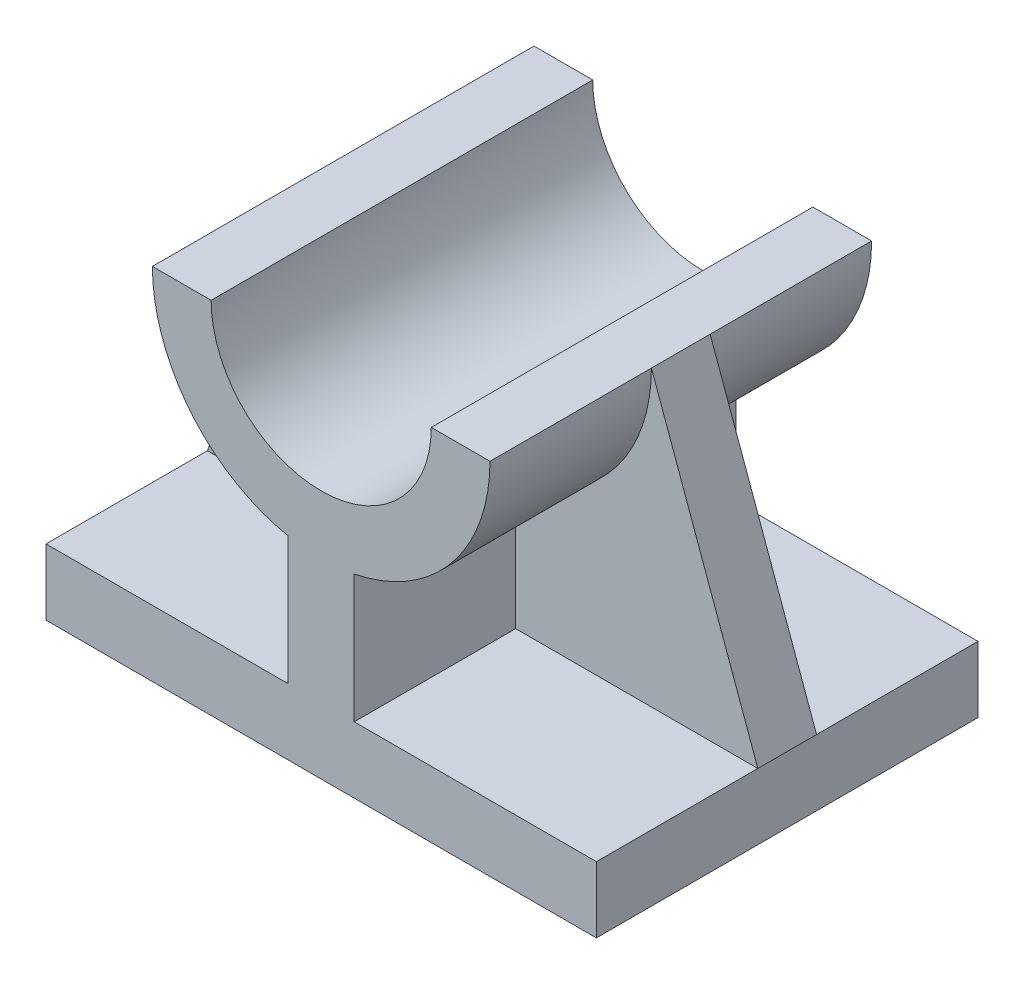
ISO-10303-21;
HEADER;
FILE_DESCRIPTION(('STEP AP214'),'2;1');
FILE_NAME('part.step','',(''),(''),'','','');
FILE_SCHEMA(('AUTOMOTIVE_DESIGN { 1 0 10303 214 1 1 1 1 }'));
ENDSEC;
DATA;
#1=APPLICATION_CONTEXT('core data for automotive mechanical design processes');
#2=APPLICATION_PROTOCOL_DEFINITION('international standard','automotive_design',2000,#1);
#3=PRODUCT_CONTEXT('',#1,'mechanical');
#4=PRODUCT('Part','Part','',(#3));
#5=PRODUCT_RELATED_PRODUCT_CATEGORY('part','',(#4));
#6=PRODUCT_DEFINITION_FORMATION('','',#4);
#7=PRODUCT_DEFINITION_CONTEXT('part definition',#1,'design');
#8=PRODUCT_DEFINITION('design','',#6,#7);
#9=PRODUCT_DEFINITION_SHAPE('','',#8);
#10=(LENGTH_UNIT() NAMED_UNIT(*) SI_UNIT(.MILLI.,.METRE.));
#11=(NAMED_UNIT(*) PLANE_ANGLE_UNIT() SI_UNIT($,.RADIAN.));
#12=(NAMED_UNIT(*) SI_UNIT($,.STERADIAN.) SOLID_ANGLE_UNIT());
#13=UNCERTAINTY_MEASURE_WITH_UNIT(LENGTH_MEASURE(1.E-05),#10,'distance_accuracy_value','');
#14=(GEOMETRIC_REPRESENTATION_CONTEXT(3) GLOBAL_UNCERTAINTY_ASSIGNED_CONTEXT((#13)) GLOBAL_UNIT_ASSIGNED_CONTEXT((#10,
#11,#12)) REPRESENTATION_CONTEXT('',''));
#15=CARTESIAN_POINT('',(0.,0.,0.));
#16=DIRECTION('',(0.,0.,1.));
#17=DIRECTION('',(1.,0.,0.));
#18=AXIS2_PLACEMENT_3D('',#15,#16,#17);
#19=CARTESIAN_POINT('',(10.4217391304348,49.,52.));
#20=DIRECTION('',(0.,0.,-1.));
#21=DIRECTION('',(-1.,0.,0.));
#22=AXIS2_PLACEMENT_3D('',#19,#20,#21);
#23=CYLINDRICAL_SURFACE('',#22,23.);
#24=CARTESIAN_POINT('',(10.4217391304348,49.,22.));
#25=DIRECTION('',(0.,0.,1.));
#26=DIRECTION('',(1.,0.,0.));
#27=AXIS2_PLACEMENT_3D('',#24,#25,#26);
#28=CIRCLE('',#27,23.);
#29=CARTESIAN_POINT('',(-12.5782608695652,49.,22.));
#30=VERTEX_POINT('',#29);
#31=CARTESIAN_POINT('',(5.92173913043479,26.4445128627201,22.));
#32=VERTEX_POINT('',#31);
#33=EDGE_CURVE('E200',#30,#32,#28,.T.);
#34=ORIENTED_EDGE('',*,*,#33,.F.);
#35=DIRECTION('',(0.,0.,-1.));
#36=VECTOR('',#35,1.);
#37=CARTESIAN_POINT('',(-12.5782608695652,49.,52.));
#38=LINE('',#37,#36);
#39=CARTESIAN_POINT('',(-12.5782608695652,49.,0.));
#40=VERTEX_POINT('',#39);
#41=EDGE_CURVE('E360',#30,#40,#38,.T.);
#42=ORIENTED_EDGE('',*,*,#41,.T.);
#43=CARTESIAN_POINT('',(10.4217391304348,49.,0.));
#44=DIRECTION('',(0.,0.,1.));
#45=DIRECTION('',(1.,0.,0.));
#46=AXIS2_PLACEMENT_3D('',#43,#44,#45);
#47=CIRCLE('',#46,23.);
#48=CARTESIAN_POINT('',(5.92173913043479,26.4445128627201,0.));
#49=VERTEX_POINT('',#48);
#50=EDGE_CURVE('E267',#40,#49,#47,.T.);
#51=ORIENTED_EDGE('',*,*,#50,.T.);
#52=DIRECTION('',(0.,0.,-1.));
#53=VECTOR('',#52,1.);
#54=CARTESIAN_POINT('',(5.92173913043479,26.4445128627201,52.));
#55=LINE('',#54,#53);
#56=EDGE_CURVE('E340',#32,#49,#55,.T.);
#57=ORIENTED_EDGE('',*,*,#56,.F.);
#58=EDGE_LOOP('',(#34,#42,#51,#57));
#59=FACE_BOUND('',#58,.T.);
#60=ADVANCED_FACE('F39',(#59),#23,.T.);
#61=CARTESIAN_POINT('',(5.9217391304348,0.,52.));
#62=DIRECTION('',(-1.,0.,0.));
#63=DIRECTION('',(0.,-1.,0.));
#64=AXIS2_PLACEMENT_3D('',#61,#62,#63);
#65=PLANE('',#64);
#66=DIRECTION('',(0.,0.,-1.));
#67=VECTOR('',#66,1.);
#68=CARTESIAN_POINT('',(5.9217391304348,9.,52.));
#69=LINE('',#68,#67);
#70=CARTESIAN_POINT('',(5.9217391304348,9.,22.));
#71=VERTEX_POINT('',#70);
#72=CARTESIAN_POINT('',(5.9217391304348,9.,0.));
#73=VERTEX_POINT('',#72);
#74=EDGE_CURVE('E206',#71,#73,#69,.T.);
#75=ORIENTED_EDGE('',*,*,#74,.F.);
#76=DIRECTION('',(0.,1.,0.));
#77=VECTOR('',#76,1.);
#78=CARTESIAN_POINT('',(5.9217391304348,0.,22.));
#79=LINE('',#78,#77);
#80=EDGE_CURVE('E327',#71,#32,#79,.T.);
#81=ORIENTED_EDGE('',*,*,#80,.T.);
#82=ORIENTED_EDGE('',*,*,#56,.T.);
#83=DIRECTION('',(0.,1.,0.));
#84=VECTOR('',#83,1.);
#85=CARTESIAN_POINT('',(5.9217391304348,0.,0.));
#86=LINE('',#85,#84);
#87=EDGE_CURVE('E264',#73,#49,#86,.T.);
#88=ORIENTED_EDGE('',*,*,#87,.F.);
#89=EDGE_LOOP('',(#75,#81,#82,#88));
#90=FACE_BOUND('',#89,.T.);
#91=ADVANCED_FACE('F338',(#90),#65,.T.);
#92=CARTESIAN_POINT('',(0.,9.,52.));
#93=DIRECTION('',(0.,1.,0.));
#94=DIRECTION('',(0.,0.,1.));
#95=AXIS2_PLACEMENT_3D('',#92,#93,#94);
#96=PLANE('',#95);
#97=DIRECTION('',(0.,0.,-1.));
#98=VECTOR('',#97,1.);
#99=CARTESIAN_POINT('',(-27.0782608695652,9.,52.));
#100=LINE('',#99,#98);
#101=CARTESIAN_POINT('',(-27.0782608695652,9.,22.));
#102=VERTEX_POINT('',#101);
#103=CARTESIAN_POINT('',(-27.0782608695652,9.,0.));
#104=VERTEX_POINT('',#103);
#105=EDGE_CURVE('E182',#102,#104,#100,.T.);
#106=ORIENTED_EDGE('',*,*,#105,.F.);
#107=DIRECTION('',(1.,0.,0.));
#108=VECTOR('',#107,1.);
#109=CARTESIAN_POINT('',(0.,9.,22.));
#110=LINE('',#109,#108);
#111=EDGE_CURVE('E191',#102,#71,#110,.T.);
#112=ORIENTED_EDGE('',*,*,#111,.T.);
#113=ORIENTED_EDGE('',*,*,#74,.T.);
#114=DIRECTION('',(1.,0.,0.));
#115=VECTOR('',#114,1.);
#116=CARTESIAN_POINT('',(0.,9.,0.));
#117=LINE('',#116,#115);
#118=EDGE_CURVE('E261',#104,#73,#117,.T.);
#119=ORIENTED_EDGE('',*,*,#118,.F.);
#120=EDGE_LOOP('',(#106,#112,#113,#119));
#121=FACE_BOUND('',#120,.T.);
#122=ADVANCED_FACE('F334',(#121),#96,.T.);
#123=CARTESIAN_POINT('',(0.,9.,52.));
#124=DIRECTION('',(0.,-1.,0.));
#125=DIRECTION('',(0.,0.,-1.));
#126=AXIS2_PLACEMENT_3D('',#123,#124,#125);
#127=PLANE('',#126);
#128=DIRECTION('',(1.,0.,0.));
#129=VECTOR('',#128,1.);
#130=CARTESIAN_POINT('',(0.,9.,30.));
#131=LINE('',#130,#129);
#132=CARTESIAN_POINT('',(14.9217391304348,9.,30.));
#133=VERTEX_POINT('',#132);
#134=CARTESIAN_POINT('',(47.9217391304348,9.00000000000001,30.));
#135=VERTEX_POINT('',#134);
#136=EDGE_CURVE('E312',#133,#135,#131,.T.);
#137=ORIENTED_EDGE('',*,*,#136,.F.);
#138=DIRECTION('',(0.,0.,-1.));
#139=VECTOR('',#138,1.);
#140=CARTESIAN_POINT('',(14.9217391304348,9.,52.));
#141=LINE('',#140,#139);
#142=CARTESIAN_POINT('',(14.9217391304348,9.,52.));
#143=VERTEX_POINT('',#142);
#144=EDGE_CURVE('E224',#143,#133,#141,.T.);
#145=ORIENTED_EDGE('',*,*,#144,.F.);
#146=DIRECTION('',(-1.,0.,0.));
#147=VECTOR('',#146,1.);
#148=CARTESIAN_POINT('',(0.,9.,52.));
#149=LINE('',#148,#147);
#150=CARTESIAN_POINT('',(47.9217391304348,9.,52.));
#151=VERTEX_POINT('',#150);
#152=EDGE_CURVE('E283',#151,#143,#149,.T.);
#153=ORIENTED_EDGE('',*,*,#152,.F.);
#154=DIRECTION('',(0.,0.,-1.));
#155=VECTOR('',#154,1.);
#156=CARTESIAN_POINT('',(47.9217391304348,9.,52.));
#157=LINE('',#156,#155);
#158=EDGE_CURVE('E218',#151,#135,#157,.T.);
#159=ORIENTED_EDGE('',*,*,#158,.T.);
#160=EDGE_LOOP('',(#137,#145,#153,#159));
#161=FACE_BOUND('',#160,.T.);
#162=ADVANCED_FACE('F398',(#161),#127,.F.);
#163=CARTESIAN_POINT('',(14.9217391304348,0.,52.));
#164=DIRECTION('',(-1.,0.,0.));
#165=DIRECTION('',(0.,0.,1.));
#166=AXIS2_PLACEMENT_3D('',#163,#164,#165);
#167=PLANE('',#166);
#168=DIRECTION('',(0.,-1.,0.));
#169=VECTOR('',#168,1.);
#170=CARTESIAN_POINT('',(14.9217391304348,0.,30.));
#171=LINE('',#170,#169);
#172=CARTESIAN_POINT('',(14.9217391304348,26.4445128627201,30.));
#173=VERTEX_POINT('',#172);
#174=EDGE_CURVE('E315',#173,#133,#171,.T.);
#175=ORIENTED_EDGE('',*,*,#174,.F.);
#176=DIRECTION('',(0.,0.,-1.));
#177=VECTOR('',#176,1.);
#178=CARTESIAN_POINT('',(14.9217391304348,26.4445128627201,52.));
#179=LINE('',#178,#177);
#180=CARTESIAN_POINT('',(14.9217391304348,26.4445128627201,52.));
#181=VERTEX_POINT('',#180);
#182=EDGE_CURVE('E228',#181,#173,#179,.T.);
#183=ORIENTED_EDGE('',*,*,#182,.F.);
#184=DIRECTION('',(0.,1.,0.));
#185=VECTOR('',#184,1.);
#186=CARTESIAN_POINT('',(14.9217391304348,0.,52.));
#187=LINE('',#186,#185);
#188=EDGE_CURVE('E281',#143,#181,#187,.T.);
#189=ORIENTED_EDGE('',*,*,#188,.F.);
#190=ORIENTED_EDGE('',*,*,#144,.T.);
#191=EDGE_LOOP('',(#175,#183,#189,#190));
#192=FACE_BOUND('',#191,.T.);
#193=ADVANCED_FACE('F401',(#192),#167,.F.);
#194=CARTESIAN_POINT('',(10.4217391304348,49.,52.));
#195=DIRECTION('',(0.,0.,-1.));
#196=DIRECTION('',(-1.,0.,0.));
#197=AXIS2_PLACEMENT_3D('',#194,#195,#196);
#198=CYLINDRICAL_SURFACE('',#197,23.);
#199=CARTESIAN_POINT('',(10.4217391304348,49.,30.));
#200=DIRECTION('',(0.,0.,-1.));
#201=DIRECTION('',(-1.,0.,0.));
#202=AXIS2_PLACEMENT_3D('',#199,#200,#201);
#203=CIRCLE('',#202,23.);
#204=CARTESIAN_POINT('',(33.4217391304348,49.,30.));
#205=VERTEX_POINT('',#204);
#206=EDGE_CURVE('E317',#205,#173,#203,.T.);
#207=ORIENTED_EDGE('',*,*,#206,.F.);
#208=DIRECTION('',(0.,0.,-1.));
#209=VECTOR('',#208,1.);
#210=CARTESIAN_POINT('',(33.4217391304348,49.,52.));
#211=LINE('',#210,#209);
#212=CARTESIAN_POINT('',(33.4217391304348,49.,52.));
#213=VERTEX_POINT('',#212);
#214=EDGE_CURVE('E232',#213,#205,#211,.T.);
#215=ORIENTED_EDGE('',*,*,#214,.F.);
#216=CARTESIAN_POINT('',(10.4217391304348,49.,52.));
#217=DIRECTION('',(0.,0.,1.));
#218=DIRECTION('',(1.,0.,0.));
#219=AXIS2_PLACEMENT_3D('',#216,#217,#218);
#220=CIRCLE('',#219,23.);
#221=EDGE_CURVE('E279',#181,#213,#220,.T.);
#222=ORIENTED_EDGE('',*,*,#221,.F.);
#223=ORIENTED_EDGE('',*,*,#182,.T.);
#224=EDGE_LOOP('',(#207,#215,#222,#223));
#225=FACE_BOUND('',#224,.T.);
#226=ADVANCED_FACE('F406',(#225),#198,.T.);
#227=CARTESIAN_POINT('',(10.4217391304348,49.,52.));
#228=DIRECTION('',(0.,0.,-1.));
#229=DIRECTION('',(-1.,0.,0.));
#230=AXIS2_PLACEMENT_3D('',#227,#228,#229);
#231=CYLINDRICAL_SURFACE('',#230,15.);
#232=CARTESIAN_POINT('',(10.4217391304348,49.,0.));
#233=DIRECTION('',(0.,0.,1.));
#234=DIRECTION('',(1.,0.,0.));
#235=AXIS2_PLACEMENT_3D('',#232,#233,#234);
#236=CIRCLE('',#235,15.);
#237=CARTESIAN_POINT('',(-4.5782608695652,49.,0.));
#238=VERTEX_POINT('',#237);
#239=CARTESIAN_POINT('',(25.4217391304348,49.,0.));
#240=VERTEX_POINT('',#239);
#241=EDGE_CURVE('E273',#238,#240,#236,.T.);
#242=ORIENTED_EDGE('',*,*,#241,.F.);
#243=DIRECTION('',(0.,0.,-1.));
#244=VECTOR('',#243,1.);
#245=CARTESIAN_POINT('',(-4.5782608695652,49.,52.));
#246=LINE('',#245,#244);
#247=CARTESIAN_POINT('',(-4.5782608695652,49.,52.));
#248=VERTEX_POINT('',#247);
#249=EDGE_CURVE('E11',#248,#238,#246,.T.);
#250=ORIENTED_EDGE('',*,*,#249,.F.);
#251=CARTESIAN_POINT('',(10.4217391304348,49.,52.));
#252=DIRECTION('',(0.,0.,1.));
#253=DIRECTION('',(1.,0.,0.));
#254=AXIS2_PLACEMENT_3D('',#251,#252,#253);
#255=CIRCLE('',#254,15.);
#256=CARTESIAN_POINT('',(25.4217391304348,49.,52.));
#257=VERTEX_POINT('',#256);
#258=EDGE_CURVE('E243',#248,#257,#255,.T.);
#259=ORIENTED_EDGE('',*,*,#258,.T.);
#260=DIRECTION('',(0.,0.,-1.));
#261=VECTOR('',#260,1.);
#262=CARTESIAN_POINT('',(25.4217391304348,49.,52.));
#263=LINE('',#262,#261);
#264=EDGE_CURVE('E237',#257,#240,#263,.T.);
#265=ORIENTED_EDGE('',*,*,#264,.T.);
#266=EDGE_LOOP('',(#242,#250,#259,#265));
#267=FACE_BOUND('',#266,.T.);
#268=ADVANCED_FACE('F41',(#267),#231,.F.);
#269=CARTESIAN_POINT('',(0.,49.,52.));
#270=DIRECTION('',(0.,1.,0.));
#271=DIRECTION('',(0.,0.,1.));
#272=AXIS2_PLACEMENT_3D('',#269,#270,#271);
#273=PLANE('',#272);
#274=ORIENTED_EDGE('',*,*,#41,.F.);
#275=DIRECTION('',(0.,0.,-1.));
#276=VECTOR('',#275,1.);
#277=CARTESIAN_POINT('',(-12.5782608695652,49.,52.));
#278=LINE('',#277,#276);
#279=CARTESIAN_POINT('',(-12.5782608695652,49.,30.));
#280=VERTEX_POINT('',#279);
#281=EDGE_CURVE('E321',#30,#280,#278,.F.);
#282=ORIENTED_EDGE('',*,*,#281,.T.);
#283=CARTESIAN_POINT('',(-12.5782608695652,49.,52.));
#284=VERTEX_POINT('',#283);
#285=EDGE_CURVE('E47',#284,#280,#38,.T.);
#286=ORIENTED_EDGE('',*,*,#285,.F.);
#287=DIRECTION('',(1.,0.,0.));
#288=VECTOR('',#287,1.);
#289=CARTESIAN_POINT('',(0.,49.,52.));
#290=LINE('',#289,#288);
#291=EDGE_CURVE('E297',#284,#248,#290,.T.);
#292=ORIENTED_EDGE('',*,*,#291,.T.);
#293=ORIENTED_EDGE('',*,*,#249,.T.);
#294=DIRECTION('',(1.,0.,0.));
#295=VECTOR('',#294,1.);
#296=CARTESIAN_POINT('',(0.,49.,0.));
#297=LINE('',#296,#295);
#298=EDGE_CURVE('E270',#40,#238,#297,.T.);
#299=ORIENTED_EDGE('',*,*,#298,.F.);
#300=EDGE_LOOP('',(#274,#282,#286,#292,#293,#299));
#301=FACE_BOUND('',#300,.T.);
#302=ADVANCED_FACE('F368',(#301),#273,.T.);
#303=ORIENTED_EDGE('',*,*,#285,.T.);
#304=CARTESIAN_POINT('',(10.4217391304348,49.,30.));
#305=DIRECTION('',(0.,0.,1.));
#306=DIRECTION('',(1.,0.,0.));
#307=AXIS2_PLACEMENT_3D('',#304,#305,#306);
#308=CIRCLE('',#307,23.);
#309=CARTESIAN_POINT('',(5.92173913043479,26.4445128627201,30.));
#310=VERTEX_POINT('',#309);
#311=EDGE_CURVE('E190',#280,#310,#308,.T.);
#312=ORIENTED_EDGE('',*,*,#311,.T.);
#313=CARTESIAN_POINT('',(5.92173913043479,26.4445128627201,52.));
#314=VERTEX_POINT('',#313);
#315=EDGE_CURVE('E358',#314,#310,#55,.T.);
#316=ORIENTED_EDGE('',*,*,#315,.F.);
#317=CARTESIAN_POINT('',(10.4217391304348,49.,52.));
#318=DIRECTION('',(0.,0.,1.));
#319=DIRECTION('',(1.,0.,0.));
#320=AXIS2_PLACEMENT_3D('',#317,#318,#319);
#321=CIRCLE('',#320,23.);
#322=EDGE_CURVE('E295',#284,#314,#321,.T.);
#323=ORIENTED_EDGE('',*,*,#322,.F.);
#324=EDGE_LOOP('',(#303,#312,#316,#323));
#325=FACE_BOUND('',#324,.T.);
#326=ADVANCED_FACE('F426',(#325),#23,.T.);
#327=DIRECTION('',(0.,1.,0.));
#328=VECTOR('',#327,1.);
#329=CARTESIAN_POINT('',(5.9217391304348,0.,30.));
#330=LINE('',#329,#328);
#331=CARTESIAN_POINT('',(5.9217391304348,9.,30.));
#332=VERTEX_POINT('',#331);
#333=EDGE_CURVE('E199',#332,#310,#330,.T.);
#334=ORIENTED_EDGE('',*,*,#333,.F.);
#335=CARTESIAN_POINT('',(5.9217391304348,9.,52.));
#336=VERTEX_POINT('',#335);
#337=EDGE_CURVE('E198',#336,#332,#69,.T.);
#338=ORIENTED_EDGE('',*,*,#337,.F.);
#339=DIRECTION('',(0.,1.,0.));
#340=VECTOR('',#339,1.);
#341=CARTESIAN_POINT('',(5.9217391304348,0.,52.));
#342=LINE('',#341,#340);
#343=EDGE_CURVE('E292',#336,#314,#342,.T.);
#344=ORIENTED_EDGE('',*,*,#343,.T.);
#345=ORIENTED_EDGE('',*,*,#315,.T.);
#346=EDGE_LOOP('',(#334,#338,#344,#345));
#347=FACE_BOUND('',#346,.T.);
#348=ADVANCED_FACE('F357',(#347),#65,.T.);
#349=DIRECTION('',(1.,0.,0.));
#350=VECTOR('',#349,1.);
#351=CARTESIAN_POINT('',(0.,9.,30.));
#352=LINE('',#351,#350);
#353=CARTESIAN_POINT('',(-27.0782608695652,9.,30.));
#354=VERTEX_POINT('',#353);
#355=EDGE_CURVE('E187',#354,#332,#352,.T.);
#356=ORIENTED_EDGE('',*,*,#355,.F.);
#357=CARTESIAN_POINT('',(-27.0782608695652,9.,52.));
#358=VERTEX_POINT('',#357);
#359=EDGE_CURVE('E181',#358,#354,#100,.T.);
#360=ORIENTED_EDGE('',*,*,#359,.F.);
#361=DIRECTION('',(1.,0.,0.));
#362=VECTOR('',#361,1.);
#363=CARTESIAN_POINT('',(0.,9.,52.));
#364=LINE('',#363,#362);
#365=EDGE_CURVE('E290',#358,#336,#364,.T.);
#366=ORIENTED_EDGE('',*,*,#365,.T.);
#367=ORIENTED_EDGE('',*,*,#337,.T.);
#368=EDGE_LOOP('',(#356,#360,#366,#367));
#369=FACE_BOUND('',#368,.T.);
#370=ADVANCED_FACE('F195',(#369),#96,.T.);
#371=CARTESIAN_POINT('',(-27.0782608695652,0.,52.));
#372=DIRECTION('',(-1.,0.,0.));
#373=DIRECTION('',(0.,0.,1.));
#374=AXIS2_PLACEMENT_3D('',#371,#372,#373);
#375=PLANE('',#374);
#376=ORIENTED_EDGE('',*,*,#359,.T.);
#377=EDGE_CURVE('E174',#354,#102,#100,.T.);
#378=ORIENTED_EDGE('',*,*,#377,.T.);
#379=ORIENTED_EDGE('',*,*,#105,.T.);
#380=DIRECTION('',(0.,1.,0.));
#381=VECTOR('',#380,1.);
#382=CARTESIAN_POINT('',(-27.0782608695652,0.,0.));
#383=LINE('',#382,#381);
#384=CARTESIAN_POINT('',(-27.0782608695652,0.,0.));
#385=VERTEX_POINT('',#384);
#386=EDGE_CURVE('E258',#385,#104,#383,.T.);
#387=ORIENTED_EDGE('',*,*,#386,.F.);
#388=DIRECTION('',(0.,0.,-1.));
#389=VECTOR('',#388,1.);
#390=CARTESIAN_POINT('',(-27.0782608695652,0.,52.));
#391=LINE('',#390,#389);
#392=CARTESIAN_POINT('',(-27.0782608695652,0.,52.));
#393=VERTEX_POINT('',#392);
#394=EDGE_CURVE('E209',#393,#385,#391,.T.);
#395=ORIENTED_EDGE('',*,*,#394,.F.);
#396=DIRECTION('',(0.,1.,0.));
#397=VECTOR('',#396,1.);
#398=CARTESIAN_POINT('',(-27.0782608695652,0.,52.));
#399=LINE('',#398,#397);
#400=EDGE_CURVE('E205',#393,#358,#399,.T.);
#401=ORIENTED_EDGE('',*,*,#400,.T.);
#402=EDGE_LOOP('',(#376,#378,#379,#387,#395,#401));
#403=FACE_BOUND('',#402,.T.);
#404=ADVANCED_FACE('F203',(#403),#375,.T.);
#405=CARTESIAN_POINT('',(0.,0.,52.));
#406=DIRECTION('',(0.,1.,0.));
#407=DIRECTION('',(0.,0.,1.));
#408=AXIS2_PLACEMENT_3D('',#405,#406,#407);
#409=PLANE('',#408);
#410=DIRECTION('',(1.,0.,0.));
#411=VECTOR('',#410,1.);
#412=CARTESIAN_POINT('',(0.,0.,0.));
#413=LINE('',#412,#411);
#414=CARTESIAN_POINT('',(47.9217391304348,0.,0.));
#415=VERTEX_POINT('',#414);
#416=EDGE_CURVE('E256',#385,#415,#413,.T.);
#417=ORIENTED_EDGE('',*,*,#416,.T.);
#418=DIRECTION('',(0.,0.,-1.));
#419=VECTOR('',#418,1.);
#420=CARTESIAN_POINT('',(47.9217391304348,0.,52.));
#421=LINE('',#420,#419);
#422=CARTESIAN_POINT('',(47.9217391304348,0.,52.));
#423=VERTEX_POINT('',#422);
#424=EDGE_CURVE('E213',#423,#415,#421,.T.);
#425=ORIENTED_EDGE('',*,*,#424,.F.);
#426=DIRECTION('',(1.,0.,0.));
#427=VECTOR('',#426,1.);
#428=CARTESIAN_POINT('',(0.,0.,52.));
#429=LINE('',#428,#427);
#430=EDGE_CURVE('E287',#393,#423,#429,.T.);
#431=ORIENTED_EDGE('',*,*,#430,.F.);
#432=ORIENTED_EDGE('',*,*,#394,.T.);
#433=EDGE_LOOP('',(#417,#425,#431,#432));
#434=FACE_BOUND('',#433,.T.);
#435=ADVANCED_FACE('F346',(#434),#409,.F.);
#436=CARTESIAN_POINT('',(47.9217391304348,0.,52.));
#437=DIRECTION('',(-1.,0.,0.));
#438=DIRECTION('',(0.,0.,1.));
#439=AXIS2_PLACEMENT_3D('',#436,#437,#438);
#440=PLANE('',#439);
#441=ORIENTED_EDGE('',*,*,#424,.T.);
#442=DIRECTION('',(0.,1.,0.));
#443=VECTOR('',#442,1.);
#444=CARTESIAN_POINT('',(47.9217391304348,0.,0.));
#445=LINE('',#444,#443);
#446=CARTESIAN_POINT('',(47.9217391304348,9.,0.));
#447=VERTEX_POINT('',#446);
#448=EDGE_CURVE('E253',#415,#447,#445,.T.);
#449=ORIENTED_EDGE('',*,*,#448,.T.);
#450=CARTESIAN_POINT('',(47.9217391304348,9.00000000000001,22.));
#451=VERTEX_POINT('',#450);
#452=EDGE_CURVE('E223',#451,#447,#157,.T.);
#453=ORIENTED_EDGE('',*,*,#452,.F.);
#454=DIRECTION('',(0.,0.,1.));
#455=VECTOR('',#454,1.);
#456=CARTESIAN_POINT('',(47.9217391304348,9.,52.));
#457=LINE('',#456,#455);
#458=EDGE_CURVE('E276',#451,#135,#457,.T.);
#459=ORIENTED_EDGE('',*,*,#458,.T.);
#460=ORIENTED_EDGE('',*,*,#158,.F.);
#461=DIRECTION('',(0.,1.,0.));
#462=VECTOR('',#461,1.);
#463=CARTESIAN_POINT('',(47.9217391304348,0.,52.));
#464=LINE('',#463,#462);
#465=EDGE_CURVE('E285',#423,#151,#464,.T.);
#466=ORIENTED_EDGE('',*,*,#465,.F.);
#467=EDGE_LOOP('',(#441,#449,#453,#459,#460,#466));
#468=FACE_BOUND('',#467,.T.);
#469=ADVANCED_FACE('F390',(#468),#440,.F.);
#470=CARTESIAN_POINT('',(14.9217391304348,9.,22.));
#471=VERTEX_POINT('',#470);
#472=CARTESIAN_POINT('',(14.9217391304348,9.,0.));
#473=VERTEX_POINT('',#472);
#474=EDGE_CURVE('E227',#471,#473,#141,.T.);
#475=ORIENTED_EDGE('',*,*,#474,.F.);
#476=DIRECTION('',(1.,0.,0.));
#477=VECTOR('',#476,1.);
#478=CARTESIAN_POINT('',(0.,9.,22.));
#479=LINE('',#478,#477);
#480=EDGE_CURVE('E304',#471,#451,#479,.T.);
#481=ORIENTED_EDGE('',*,*,#480,.T.);
#482=ORIENTED_EDGE('',*,*,#452,.T.);
#483=DIRECTION('',(-1.,0.,0.));
#484=VECTOR('',#483,1.);
#485=CARTESIAN_POINT('',(0.,9.,0.));
#486=LINE('',#485,#484);
#487=EDGE_CURVE('E250',#447,#473,#486,.T.);
#488=ORIENTED_EDGE('',*,*,#487,.T.);
#489=EDGE_LOOP('',(#475,#481,#482,#488));
#490=FACE_BOUND('',#489,.T.);
#491=ADVANCED_FACE('F387',(#490),#127,.F.);
#492=CARTESIAN_POINT('',(14.9217391304348,26.4445128627201,22.));
#493=VERTEX_POINT('',#492);
#494=CARTESIAN_POINT('',(14.9217391304348,26.4445128627201,0.));
#495=VERTEX_POINT('',#494);
#496=EDGE_CURVE('E231',#493,#495,#179,.T.);
#497=ORIENTED_EDGE('',*,*,#496,.F.);
#498=DIRECTION('',(0.,-1.,0.));
#499=VECTOR('',#498,1.);
#500=CARTESIAN_POINT('',(14.9217391304348,0.,22.));
#501=LINE('',#500,#499);
#502=EDGE_CURVE('E307',#493,#471,#501,.T.);
#503=ORIENTED_EDGE('',*,*,#502,.T.);
#504=ORIENTED_EDGE('',*,*,#474,.T.);
#505=DIRECTION('',(0.,1.,0.));
#506=VECTOR('',#505,1.);
#507=CARTESIAN_POINT('',(14.9217391304348,0.,0.));
#508=LINE('',#507,#506);
#509=EDGE_CURVE('E247',#473,#495,#508,.T.);
#510=ORIENTED_EDGE('',*,*,#509,.T.);
#511=EDGE_LOOP('',(#497,#503,#504,#510));
#512=FACE_BOUND('',#511,.T.);
#513=ADVANCED_FACE('F383',(#512),#167,.F.);
#514=CARTESIAN_POINT('',(33.4217391304348,49.,22.));
#515=VERTEX_POINT('',#514);
#516=CARTESIAN_POINT('',(33.4217391304348,49.,0.));
#517=VERTEX_POINT('',#516);
#518=EDGE_CURVE('E236',#515,#517,#211,.T.);
#519=ORIENTED_EDGE('',*,*,#518,.F.);
#520=CARTESIAN_POINT('',(10.4217391304348,49.,22.));
#521=DIRECTION('',(0.,0.,-1.));
#522=DIRECTION('',(-1.,0.,0.));
#523=AXIS2_PLACEMENT_3D('',#520,#521,#522);
#524=CIRCLE('',#523,23.);
#525=EDGE_CURVE('E310',#515,#493,#524,.T.);
#526=ORIENTED_EDGE('',*,*,#525,.T.);
#527=ORIENTED_EDGE('',*,*,#496,.T.);
#528=CARTESIAN_POINT('',(10.4217391304348,49.,0.));
#529=DIRECTION('',(0.,0.,1.));
#530=DIRECTION('',(1.,0.,0.));
#531=AXIS2_PLACEMENT_3D('',#528,#529,#530);
#532=CIRCLE('',#531,23.);
#533=EDGE_CURVE('E244',#495,#517,#532,.T.);
#534=ORIENTED_EDGE('',*,*,#533,.T.);
#535=EDGE_LOOP('',(#519,#526,#527,#534));
#536=FACE_BOUND('',#535,.T.);
#537=ADVANCED_FACE('F378',(#536),#198,.T.);
#538=CARTESIAN_POINT('',(0.,49.,52.));
#539=DIRECTION('',(0.,1.,0.));
#540=DIRECTION('',(0.,0.,1.));
#541=AXIS2_PLACEMENT_3D('',#538,#539,#540);
#542=PLANE('',#541);
#543=DIRECTION('',(1.,0.,0.));
#544=VECTOR('',#543,1.);
#545=CARTESIAN_POINT('',(0.,49.,0.));
#546=LINE('',#545,#544);
#547=EDGE_CURVE('E240',#240,#517,#546,.T.);
#548=ORIENTED_EDGE('',*,*,#547,.F.);
#549=ORIENTED_EDGE('',*,*,#264,.F.);
#550=DIRECTION('',(1.,0.,0.));
#551=VECTOR('',#550,1.);
#552=CARTESIAN_POINT('',(0.,49.,52.));
#553=LINE('',#552,#551);
#554=EDGE_CURVE('E239',#257,#213,#553,.T.);
#555=ORIENTED_EDGE('',*,*,#554,.T.);
#556=ORIENTED_EDGE('',*,*,#214,.T.);
#557=EDGE_CURVE('E235',#205,#515,#211,.T.);
#558=ORIENTED_EDGE('',*,*,#557,.T.);
#559=ORIENTED_EDGE('',*,*,#518,.T.);
#560=EDGE_LOOP('',(#548,#549,#555,#556,#558,#559));
#561=FACE_BOUND('',#560,.T.);
#562=ADVANCED_FACE('F374',(#561),#542,.T.);
#563=CARTESIAN_POINT('',(0.,0.,52.));
#564=DIRECTION('',(0.,0.,1.));
#565=DIRECTION('',(1.,0.,0.));
#566=AXIS2_PLACEMENT_3D('',#563,#564,#565);
#567=PLANE('',#566);
#568=ORIENTED_EDGE('',*,*,#258,.F.);
#569=ORIENTED_EDGE('',*,*,#291,.F.);
#570=ORIENTED_EDGE('',*,*,#322,.T.);
#571=ORIENTED_EDGE('',*,*,#343,.F.);
#572=ORIENTED_EDGE('',*,*,#365,.F.);
#573=ORIENTED_EDGE('',*,*,#400,.F.);
#574=ORIENTED_EDGE('',*,*,#430,.T.);
#575=ORIENTED_EDGE('',*,*,#465,.T.);
#576=ORIENTED_EDGE('',*,*,#152,.T.);
#577=ORIENTED_EDGE('',*,*,#188,.T.);
#578=ORIENTED_EDGE('',*,*,#221,.T.);
#579=ORIENTED_EDGE('',*,*,#554,.F.);
#580=EDGE_LOOP('',(#568,#569,#570,#571,#572,#573,#574,#575,#576,#577,#578,#579));
#581=FACE_BOUND('',#580,.T.);
#582=ADVANCED_FACE('F350',(#581),#567,.T.);
#583=CARTESIAN_POINT('',(0.,0.,0.));
#584=DIRECTION('',(0.,0.,1.));
#585=DIRECTION('',(1.,0.,0.));
#586=AXIS2_PLACEMENT_3D('',#583,#584,#585);
#587=PLANE('',#586);
#588=ORIENTED_EDGE('',*,*,#241,.T.);
#589=ORIENTED_EDGE('',*,*,#547,.T.);
#590=ORIENTED_EDGE('',*,*,#533,.F.);
#591=ORIENTED_EDGE('',*,*,#509,.F.);
#592=ORIENTED_EDGE('',*,*,#487,.F.);
#593=ORIENTED_EDGE('',*,*,#448,.F.);
#594=ORIENTED_EDGE('',*,*,#416,.F.);
#595=ORIENTED_EDGE('',*,*,#386,.T.);
#596=ORIENTED_EDGE('',*,*,#118,.T.);
#597=ORIENTED_EDGE('',*,*,#87,.T.);
#598=ORIENTED_EDGE('',*,*,#50,.F.);
#599=ORIENTED_EDGE('',*,*,#298,.T.);
#600=EDGE_LOOP('',(#588,#589,#590,#591,#592,#593,#594,#595,#596,#597,#598,#599));
#601=FACE_BOUND('',#600,.T.);
#602=ADVANCED_FACE('F343',(#601),#587,.F.);
#603=CARTESIAN_POINT('',(47.9217391304348,9.00000000000001,26.));
#604=DIRECTION('',(0.940136065162483,0.3407993236214,0.));
#605=DIRECTION('',(0.3407993236214,-0.940136065162483,0.));
#606=AXIS2_PLACEMENT_3D('',#603,#604,#605);
#607=PLANE('',#606);
#608=ORIENTED_EDGE('',*,*,#458,.F.);
#609=DIRECTION('',(0.3407993236214,-0.940136065162483,0.));
#610=VECTOR('',#609,1.);
#611=CARTESIAN_POINT('',(33.4217391304348,49.,22.));
#612=LINE('',#611,#610);
#613=EDGE_CURVE('E62',#515,#451,#612,.T.);
#614=ORIENTED_EDGE('',*,*,#613,.F.);
#615=ORIENTED_EDGE('',*,*,#557,.F.);
#616=DIRECTION('',(0.3407993236214,-0.940136065162483,0.));
#617=VECTOR('',#616,1.);
#618=CARTESIAN_POINT('',(33.4217391304348,49.,30.));
#619=LINE('',#618,#617);
#620=EDGE_CURVE('E319',#205,#135,#619,.T.);
#621=ORIENTED_EDGE('',*,*,#620,.T.);
#622=EDGE_LOOP('',(#608,#614,#615,#621));
#623=FACE_BOUND('',#622,.T.);
#624=ADVANCED_FACE('F411',(#623),#607,.T.);
#625=CARTESIAN_POINT('',(33.4217391304348,49.,22.));
#626=DIRECTION('',(0.,0.,-1.));
#627=DIRECTION('',(-1.,0.,0.));
#628=AXIS2_PLACEMENT_3D('',#625,#626,#627);
#629=PLANE('',#628);
#630=ORIENTED_EDGE('',*,*,#480,.F.);
#631=ORIENTED_EDGE('',*,*,#502,.F.);
#632=ORIENTED_EDGE('',*,*,#525,.F.);
#633=ORIENTED_EDGE('',*,*,#613,.T.);
#634=EDGE_LOOP('',(#630,#631,#632,#633));
#635=FACE_BOUND('',#634,.T.);
#636=ADVANCED_FACE('F413',(#635),#629,.T.);
#637=CARTESIAN_POINT('',(33.4217391304348,49.,30.));
#638=DIRECTION('',(0.,0.,-1.));
#639=DIRECTION('',(-1.,0.,0.));
#640=AXIS2_PLACEMENT_3D('',#637,#638,#639);
#641=PLANE('',#640);
#642=ORIENTED_EDGE('',*,*,#206,.T.);
#643=ORIENTED_EDGE('',*,*,#174,.T.);
#644=ORIENTED_EDGE('',*,*,#136,.T.);
#645=ORIENTED_EDGE('',*,*,#620,.F.);
#646=EDGE_LOOP('',(#642,#643,#644,#645));
#647=FACE_BOUND('',#646,.T.);
#648=ADVANCED_FACE('F410',(#647),#641,.F.);
#649=CARTESIAN_POINT('',(-27.0782608695652,9.,26.));
#650=DIRECTION('',(-0.940136065162483,0.3407993236214,0.));
#651=DIRECTION('',(-0.3407993236214,-0.940136065162483,0.));
#652=AXIS2_PLACEMENT_3D('',#649,#650,#651);
#653=PLANE('',#652);
#654=ORIENTED_EDGE('',*,*,#281,.F.);
#655=DIRECTION('',(-0.3407993236214,-0.940136065162483,0.));
#656=VECTOR('',#655,1.);
#657=CARTESIAN_POINT('',(-12.5782608695652,49.,22.));
#658=LINE('',#657,#656);
#659=EDGE_CURVE('E54',#30,#102,#658,.T.);
#660=ORIENTED_EDGE('',*,*,#659,.T.);
#661=ORIENTED_EDGE('',*,*,#377,.F.);
#662=DIRECTION('',(-0.3407993236214,-0.940136065162483,0.));
#663=VECTOR('',#662,1.);
#664=CARTESIAN_POINT('',(-12.5782608695652,49.,30.));
#665=LINE('',#664,#663);
#666=EDGE_CURVE('E177',#280,#354,#665,.T.);
#667=ORIENTED_EDGE('',*,*,#666,.F.);
#668=EDGE_LOOP('',(#654,#660,#661,#667));
#669=FACE_BOUND('',#668,.T.);
#670=ADVANCED_FACE('F176',(#669),#653,.T.);
#671=CARTESIAN_POINT('',(-12.5782608695652,49.,30.));
#672=DIRECTION('',(0.,0.,1.));
#673=DIRECTION('',(1.,0.,0.));
#674=AXIS2_PLACEMENT_3D('',#671,#672,#673);
#675=PLANE('',#674);
#676=ORIENTED_EDGE('',*,*,#311,.F.);
#677=ORIENTED_EDGE('',*,*,#666,.T.);
#678=ORIENTED_EDGE('',*,*,#355,.T.);
#679=ORIENTED_EDGE('',*,*,#333,.T.);
#680=EDGE_LOOP('',(#676,#677,#678,#679));
#681=FACE_BOUND('',#680,.T.);
#682=ADVANCED_FACE('F186',(#681),#675,.T.);
#683=CARTESIAN_POINT('',(-12.5782608695652,49.,22.));
#684=DIRECTION('',(0.,0.,1.));
#685=DIRECTION('',(1.,0.,0.));
#686=AXIS2_PLACEMENT_3D('',#683,#684,#685);
#687=PLANE('',#686);
#688=ORIENTED_EDGE('',*,*,#659,.F.);
#689=ORIENTED_EDGE('',*,*,#33,.T.);
#690=ORIENTED_EDGE('',*,*,#80,.F.);
#691=ORIENTED_EDGE('',*,*,#111,.F.);
#692=EDGE_LOOP('',(#688,#689,#690,#691));
#693=FACE_BOUND('',#692,.T.);
#694=ADVANCED_FACE('F593',(#693),#687,.F.);
#695=CLOSED_SHELL('',(#60,#91,#122,#162,#193,#226,#268,#302,#326,#348,#370,#404,#435,#469,#491,
#513,#537,#562,#582,#602,#624,#636,#648,#670,#682,#694));
#696=MANIFOLD_SOLID_BREP('B2',#695);
#697=ADVANCED_BREP_SHAPE_REPRESENTATION('',(#18,#696),#14);
#698=SHAPE_DEFINITION_REPRESENTATION(#9,#697);
ENDSEC;
END-ISO-10303-21;
